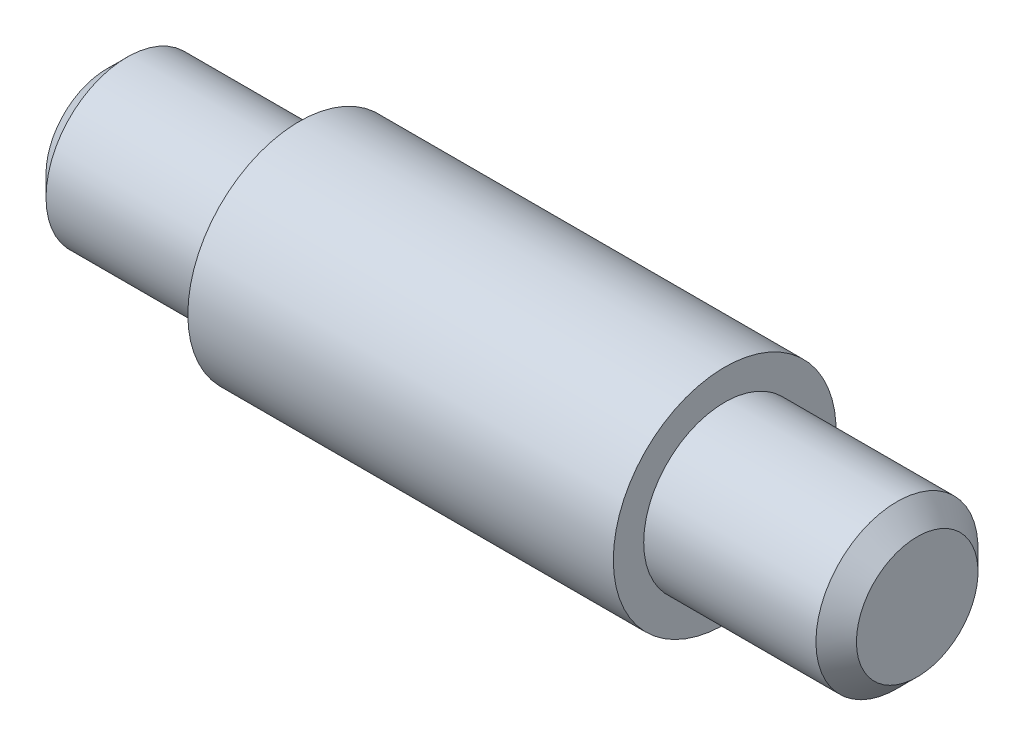
ISO-10303-21;
HEADER;
FILE_DESCRIPTION(('STEP AP214'),'2;1');
FILE_NAME('part.step','',(''),(''),'','','');
FILE_SCHEMA(('AUTOMOTIVE_DESIGN { 1 0 10303 214 1 1 1 1 }'));
ENDSEC;
DATA;
#1=APPLICATION_CONTEXT('core data for automotive mechanical design processes');
#2=APPLICATION_PROTOCOL_DEFINITION('international standard','automotive_design',2000,#1);
#3=PRODUCT_CONTEXT('',#1,'mechanical');
#4=PRODUCT('Part','Part','',(#3));
#5=PRODUCT_RELATED_PRODUCT_CATEGORY('part','',(#4));
#6=PRODUCT_DEFINITION_FORMATION('','',#4);
#7=PRODUCT_DEFINITION_CONTEXT('part definition',#1,'design');
#8=PRODUCT_DEFINITION('design','',#6,#7);
#9=PRODUCT_DEFINITION_SHAPE('','',#8);
#10=(LENGTH_UNIT() NAMED_UNIT(*) SI_UNIT(.MILLI.,.METRE.));
#11=(NAMED_UNIT(*) PLANE_ANGLE_UNIT() SI_UNIT($,.RADIAN.));
#12=(NAMED_UNIT(*) SI_UNIT($,.STERADIAN.) SOLID_ANGLE_UNIT());
#13=UNCERTAINTY_MEASURE_WITH_UNIT(LENGTH_MEASURE(1.E-05),#10,'distance_accuracy_value','');
#14=(GEOMETRIC_REPRESENTATION_CONTEXT(3) GLOBAL_UNCERTAINTY_ASSIGNED_CONTEXT((#13)) GLOBAL_UNIT_ASSIGNED_CONTEXT((#10,
#11,#12)) REPRESENTATION_CONTEXT('',''));
#15=CARTESIAN_POINT('',(0.,0.,0.));
#16=DIRECTION('',(0.,0.,1.));
#17=DIRECTION('',(1.,0.,0.));
#18=AXIS2_PLACEMENT_3D('',#15,#16,#17);
#19=CARTESIAN_POINT('',(0.,0.,0.));
#20=DIRECTION('',(-1.,0.,0.));
#21=DIRECTION('',(0.,0.,1.));
#22=AXIS2_PLACEMENT_3D('',#19,#20,#21);
#23=CYLINDRICAL_SURFACE('',#22,11.);
#24=CARTESIAN_POINT('',(21.,0.,0.));
#25=DIRECTION('',(-1.,0.,0.));
#26=DIRECTION('',(0.,0.,1.));
#27=AXIS2_PLACEMENT_3D('',#24,#25,#26);
#28=CIRCLE('',#27,11.);
#29=CARTESIAN_POINT('',(21.,0.,11.));
#30=VERTEX_POINT('',#29);
#31=EDGE_CURVE('E40',#30,#30,#28,.T.);
#32=ORIENTED_EDGE('',*,*,#31,.T.);
#33=EDGE_LOOP('',(#32));
#34=FACE_BOUND('',#33,.T.);
#35=CARTESIAN_POINT('',(-21.,0.,0.));
#36=DIRECTION('',(-1.,0.,0.));
#37=DIRECTION('',(0.,0.,1.));
#38=AXIS2_PLACEMENT_3D('',#35,#36,#37);
#39=CIRCLE('',#38,11.);
#40=CARTESIAN_POINT('',(-21.,0.,11.));
#41=VERTEX_POINT('',#40);
#42=EDGE_CURVE('E55',#41,#41,#39,.T.);
#43=ORIENTED_EDGE('',*,*,#42,.F.);
#44=EDGE_LOOP('',(#43));
#45=FACE_BOUND('',#44,.T.);
#46=ADVANCED_FACE('F30',(#34,#45),#23,.T.);
#47=CARTESIAN_POINT('',(21.,11.,0.));
#48=DIRECTION('',(-1.,0.,0.));
#49=DIRECTION('',(0.,0.,1.));
#50=AXIS2_PLACEMENT_3D('',#47,#48,#49);
#51=PLANE('',#50);
#52=ORIENTED_EDGE('',*,*,#31,.F.);
#53=EDGE_LOOP('',(#52));
#54=FACE_BOUND('',#53,.T.);
#55=CARTESIAN_POINT('',(21.,0.,0.));
#56=DIRECTION('',(-1.,0.,0.));
#57=DIRECTION('',(0.,0.,1.));
#58=AXIS2_PLACEMENT_3D('',#55,#56,#57);
#59=CIRCLE('',#58,8.);
#60=CARTESIAN_POINT('',(21.,0.,8.));
#61=VERTEX_POINT('',#60);
#62=EDGE_CURVE('E44',#61,#61,#59,.T.);
#63=ORIENTED_EDGE('',*,*,#62,.T.);
#64=EDGE_LOOP('',(#63));
#65=FACE_BOUND('',#64,.T.);
#66=ADVANCED_FACE('F80',(#54,#65),#51,.F.);
#67=CARTESIAN_POINT('',(0.,0.,0.));
#68=DIRECTION('',(-1.,0.,0.));
#69=DIRECTION('',(0.,0.,1.));
#70=AXIS2_PLACEMENT_3D('',#67,#68,#69);
#71=CYLINDRICAL_SURFACE('',#70,8.);
#72=CARTESIAN_POINT('',(38.,0.,0.));
#73=DIRECTION('',(-1.,0.,0.));
#74=DIRECTION('',(0.,0.,1.));
#75=AXIS2_PLACEMENT_3D('',#72,#73,#74);
#76=CIRCLE('',#75,8.);
#77=CARTESIAN_POINT('',(38.,0.,8.));
#78=VERTEX_POINT('',#77);
#79=EDGE_CURVE('E36',#78,#78,#76,.T.);
#80=ORIENTED_EDGE('',*,*,#79,.T.);
#81=EDGE_LOOP('',(#80));
#82=FACE_BOUND('',#81,.T.);
#83=ORIENTED_EDGE('',*,*,#62,.F.);
#84=EDGE_LOOP('',(#83));
#85=FACE_BOUND('',#84,.T.);
#86=ADVANCED_FACE('F85',(#82,#85),#71,.T.);
#87=CARTESIAN_POINT('',(40.,8.,0.));
#88=DIRECTION('',(-1.,0.,0.));
#89=DIRECTION('',(0.,0.,1.));
#90=AXIS2_PLACEMENT_3D('',#87,#88,#89);
#91=PLANE('',#90);
#92=CARTESIAN_POINT('',(40.,0.,0.));
#93=DIRECTION('',(-1.,0.,0.));
#94=DIRECTION('',(0.,0.,1.));
#95=AXIS2_PLACEMENT_3D('',#92,#93,#94);
#96=CIRCLE('',#95,5.99999999999999);
#97=CARTESIAN_POINT('',(40.,0.,5.99999999999999));
#98=VERTEX_POINT('',#97);
#99=EDGE_CURVE('E10',#98,#98,#96,.F.);
#100=ORIENTED_EDGE('',*,*,#99,.T.);
#101=EDGE_LOOP('',(#100));
#102=FACE_BOUND('',#101,.T.);
#103=ADVANCED_FACE('F76',(#102),#91,.F.);
#104=CARTESIAN_POINT('',(38.,0.,0.));
#105=DIRECTION('',(-1.,0.,0.));
#106=DIRECTION('',(0.,0.,1.));
#107=AXIS2_PLACEMENT_3D('',#104,#105,#106);
#108=CONICAL_SURFACE('',#107,8.,0.78539816339745);
#109=ORIENTED_EDGE('',*,*,#99,.F.);
#110=EDGE_LOOP('',(#109));
#111=FACE_BOUND('',#110,.T.);
#112=ORIENTED_EDGE('',*,*,#79,.F.);
#113=EDGE_LOOP('',(#112));
#114=FACE_BOUND('',#113,.T.);
#115=ADVANCED_FACE('F66',(#111,#114),#108,.T.);
#116=CARTESIAN_POINT('',(-21.,11.,0.));
#117=DIRECTION('',(1.,0.,0.));
#118=DIRECTION('',(0.,0.,1.));
#119=AXIS2_PLACEMENT_3D('',#116,#117,#118);
#120=PLANE('',#119);
#121=ORIENTED_EDGE('',*,*,#42,.T.);
#122=EDGE_LOOP('',(#121));
#123=FACE_BOUND('',#122,.T.);
#124=CARTESIAN_POINT('',(-21.,0.,0.));
#125=DIRECTION('',(-1.,0.,0.));
#126=DIRECTION('',(0.,0.,1.));
#127=AXIS2_PLACEMENT_3D('',#124,#125,#126);
#128=CIRCLE('',#127,8.);
#129=CARTESIAN_POINT('',(-21.,0.,8.));
#130=VERTEX_POINT('',#129);
#131=EDGE_CURVE('E58',#130,#130,#128,.T.);
#132=ORIENTED_EDGE('',*,*,#131,.F.);
#133=EDGE_LOOP('',(#132));
#134=FACE_BOUND('',#133,.T.);
#135=ADVANCED_FACE('F64',(#123,#134),#120,.F.);
#136=CARTESIAN_POINT('',(0.,0.,0.));
#137=DIRECTION('',(1.,0.,0.));
#138=DIRECTION('',(0.,0.,1.));
#139=AXIS2_PLACEMENT_3D('',#136,#137,#138);
#140=CYLINDRICAL_SURFACE('',#139,8.);
#141=CARTESIAN_POINT('',(-38.,0.,0.));
#142=DIRECTION('',(-1.,0.,0.));
#143=DIRECTION('',(0.,0.,1.));
#144=AXIS2_PLACEMENT_3D('',#141,#142,#143);
#145=CIRCLE('',#144,8.);
#146=CARTESIAN_POINT('',(-38.,0.,8.));
#147=VERTEX_POINT('',#146);
#148=EDGE_CURVE('E52',#147,#147,#145,.T.);
#149=ORIENTED_EDGE('',*,*,#148,.F.);
#150=EDGE_LOOP('',(#149));
#151=FACE_BOUND('',#150,.T.);
#152=ORIENTED_EDGE('',*,*,#131,.T.);
#153=EDGE_LOOP('',(#152));
#154=FACE_BOUND('',#153,.T.);
#155=ADVANCED_FACE('F62',(#151,#154),#140,.T.);
#156=CARTESIAN_POINT('',(-40.,8.,0.));
#157=DIRECTION('',(1.,0.,0.));
#158=DIRECTION('',(0.,0.,1.));
#159=AXIS2_PLACEMENT_3D('',#156,#157,#158);
#160=PLANE('',#159);
#161=CARTESIAN_POINT('',(-40.,0.,0.));
#162=DIRECTION('',(-1.,0.,0.));
#163=DIRECTION('',(0.,0.,1.));
#164=AXIS2_PLACEMENT_3D('',#161,#162,#163);
#165=CIRCLE('',#164,5.99999999999999);
#166=CARTESIAN_POINT('',(-40.,0.,5.99999999999999));
#167=VERTEX_POINT('',#166);
#168=EDGE_CURVE('E49',#167,#167,#165,.F.);
#169=ORIENTED_EDGE('',*,*,#168,.F.);
#170=EDGE_LOOP('',(#169));
#171=FACE_BOUND('',#170,.T.);
#172=ADVANCED_FACE('F73',(#171),#160,.F.);
#173=CARTESIAN_POINT('',(-38.,0.,0.));
#174=DIRECTION('',(1.,0.,0.));
#175=DIRECTION('',(0.,0.,1.));
#176=AXIS2_PLACEMENT_3D('',#173,#174,#175);
#177=CONICAL_SURFACE('',#176,8.,0.78539816339745);
#178=ORIENTED_EDGE('',*,*,#168,.T.);
#179=EDGE_LOOP('',(#178));
#180=FACE_BOUND('',#179,.T.);
#181=ORIENTED_EDGE('',*,*,#148,.T.);
#182=EDGE_LOOP('',(#181));
#183=FACE_BOUND('',#182,.T.);
#184=ADVANCED_FACE('F126',(#180,#183),#177,.T.);
#185=CLOSED_SHELL('',(#46,#66,#86,#103,#115,#135,#155,#172,#184));
#186=MANIFOLD_SOLID_BREP('B2',#185);
#187=ADVANCED_BREP_SHAPE_REPRESENTATION('',(#18,#186),#14);
#188=SHAPE_DEFINITION_REPRESENTATION(#9,#187);
ENDSEC;
END-ISO-10303-21;
